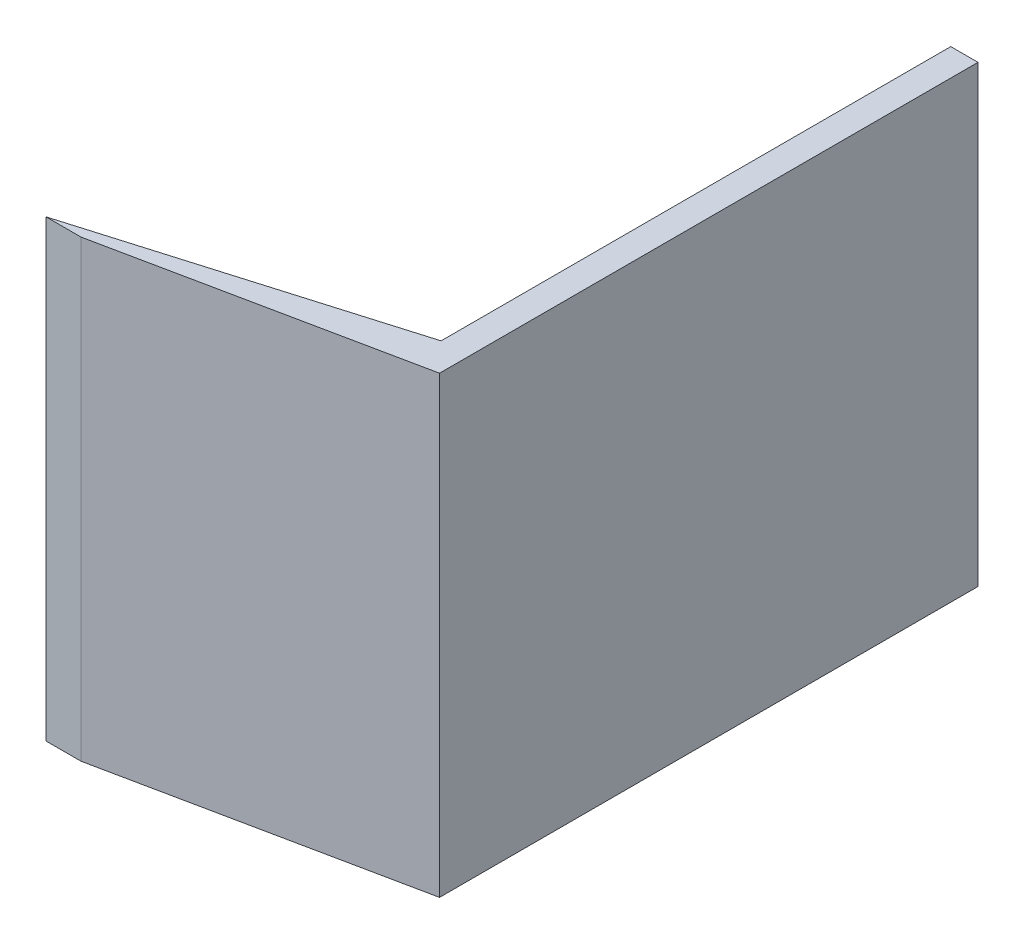
ISO-10303-21;
HEADER;
FILE_DESCRIPTION(('STEP AP214'),'2;1');
FILE_NAME('part.step','',(''),(''),'','','');
FILE_SCHEMA(('AUTOMOTIVE_DESIGN { 1 0 10303 214 1 1 1 1 }'));
ENDSEC;
DATA;
#1=APPLICATION_CONTEXT('core data for automotive mechanical design processes');
#2=APPLICATION_PROTOCOL_DEFINITION('international standard','automotive_design',2000,#1);
#3=PRODUCT_CONTEXT('',#1,'mechanical');
#4=PRODUCT('Part','Part','',(#3));
#5=PRODUCT_RELATED_PRODUCT_CATEGORY('part','',(#4));
#6=PRODUCT_DEFINITION_FORMATION('','',#4);
#7=PRODUCT_DEFINITION_CONTEXT('part definition',#1,'design');
#8=PRODUCT_DEFINITION('design','',#6,#7);
#9=PRODUCT_DEFINITION_SHAPE('','',#8);
#10=(LENGTH_UNIT() NAMED_UNIT(*) SI_UNIT(.MILLI.,.METRE.));
#11=(NAMED_UNIT(*) PLANE_ANGLE_UNIT() SI_UNIT($,.RADIAN.));
#12=(NAMED_UNIT(*) SI_UNIT($,.STERADIAN.) SOLID_ANGLE_UNIT());
#13=UNCERTAINTY_MEASURE_WITH_UNIT(LENGTH_MEASURE(1.E-05),#10,'distance_accuracy_value','');
#14=(GEOMETRIC_REPRESENTATION_CONTEXT(3) GLOBAL_UNCERTAINTY_ASSIGNED_CONTEXT((#13)) GLOBAL_UNIT_ASSIGNED_CONTEXT((#10,
#11,#12)) REPRESENTATION_CONTEXT('',''));
#15=CARTESIAN_POINT('',(0.,0.,0.));
#16=DIRECTION('',(0.,0.,1.));
#17=DIRECTION('',(1.,0.,0.));
#18=AXIS2_PLACEMENT_3D('',#15,#16,#17);
#19=CARTESIAN_POINT('',(0.,50.,0.));
#20=DIRECTION('',(1.,0.,0.));
#21=DIRECTION('',(0.,0.,-1.));
#22=AXIS2_PLACEMENT_3D('',#19,#20,#21);
#23=PLANE('',#22);
#24=DIRECTION('',(0.,0.,1.));
#25=VECTOR('',#24,1.);
#26=CARTESIAN_POINT('',(0.,0.,0.));
#27=LINE('',#26,#25);
#28=CARTESIAN_POINT('',(0.,0.,-46.72));
#29=VERTEX_POINT('',#28);
#30=CARTESIAN_POINT('',(0.,0.,0.));
#31=VERTEX_POINT('',#30);
#32=EDGE_CURVE('E132',#29,#31,#27,.T.);
#33=ORIENTED_EDGE('',*,*,#32,.T.);
#34=DIRECTION('',(0.,-1.,0.));
#35=VECTOR('',#34,1.);
#36=CARTESIAN_POINT('',(0.,50.,0.));
#37=LINE('',#36,#35);
#38=CARTESIAN_POINT('',(0.,50.,0.));
#39=VERTEX_POINT('',#38);
#40=EDGE_CURVE('E11',#39,#31,#37,.T.);
#41=ORIENTED_EDGE('',*,*,#40,.F.);
#42=DIRECTION('',(0.,0.,1.));
#43=VECTOR('',#42,1.);
#44=CARTESIAN_POINT('',(0.,50.,0.));
#45=LINE('',#44,#43);
#46=CARTESIAN_POINT('',(0.,50.,-46.72));
#47=VERTEX_POINT('',#46);
#48=EDGE_CURVE('E148',#47,#39,#45,.T.);
#49=ORIENTED_EDGE('',*,*,#48,.F.);
#50=DIRECTION('',(0.,-1.,0.));
#51=VECTOR('',#50,1.);
#52=CARTESIAN_POINT('',(0.,50.,-46.72));
#53=LINE('',#52,#51);
#54=EDGE_CURVE('E128',#47,#29,#53,.T.);
#55=ORIENTED_EDGE('',*,*,#54,.T.);
#56=EDGE_LOOP('',(#33,#41,#49,#55));
#57=FACE_BOUND('',#56,.T.);
#58=ADVANCED_FACE('F35',(#57),#23,.F.);
#59=CARTESIAN_POINT('',(0.,50.,0.));
#60=DIRECTION('',(0.999984471830344,0.,-0.00557279985182867));
#61=DIRECTION('',(-0.00557279985182867,0.,-0.999984471830344));
#62=AXIS2_PLACEMENT_3D('',#59,#60,#61);
#63=PLANE('',#62);
#64=DIRECTION('',(0.00557279985182867,0.,0.999984471830344));
#65=VECTOR('',#64,1.);
#66=CARTESIAN_POINT('',(0.,0.,0.));
#67=LINE('',#66,#65);
#68=CARTESIAN_POINT('',(0.000186336589127773,0.,0.0334362798980588));
#69=VERTEX_POINT('',#68);
#70=EDGE_CURVE('E135',#31,#69,#67,.T.);
#71=ORIENTED_EDGE('',*,*,#70,.T.);
#72=DIRECTION('',(0.,-1.,0.));
#73=VECTOR('',#72,1.);
#74=CARTESIAN_POINT('',(0.000186336589127773,50.,0.0334362798980588));
#75=LINE('',#74,#73);
#76=CARTESIAN_POINT('',(0.000186336589127773,50.,0.0334362798980588));
#77=VERTEX_POINT('',#76);
#78=EDGE_CURVE('E43',#77,#69,#75,.T.);
#79=ORIENTED_EDGE('',*,*,#78,.F.);
#80=DIRECTION('',(0.00557279985182867,0.,0.999984471830344));
#81=VECTOR('',#80,1.);
#82=CARTESIAN_POINT('',(0.,50.,0.));
#83=LINE('',#82,#81);
#84=EDGE_CURVE('E94',#39,#77,#83,.T.);
#85=ORIENTED_EDGE('',*,*,#84,.F.);
#86=ORIENTED_EDGE('',*,*,#40,.T.);
#87=EDGE_LOOP('',(#71,#79,#85,#86));
#88=FACE_BOUND('',#87,.T.);
#89=ADVANCED_FACE('F178',(#88),#63,.F.);
#90=CARTESIAN_POINT('',(0.000186336589127775,50.,0.));
#91=DIRECTION('',(1.,0.,0.));
#92=DIRECTION('',(0.,0.,-1.));
#93=AXIS2_PLACEMENT_3D('',#90,#91,#92);
#94=PLANE('',#93);
#95=DIRECTION('',(0.,0.,1.));
#96=VECTOR('',#95,1.);
#97=CARTESIAN_POINT('',(0.000186336589127775,0.,0.));
#98=LINE('',#97,#96);
#99=CARTESIAN_POINT('',(0.000186336589127339,0.,9.41378964474691));
#100=VERTEX_POINT('',#99);
#101=EDGE_CURVE('E137',#69,#100,#98,.T.);
#102=ORIENTED_EDGE('',*,*,#101,.T.);
#103=DIRECTION('',(0.,-1.,0.));
#104=VECTOR('',#103,1.);
#105=CARTESIAN_POINT('',(0.000186336589127339,50.,9.41378964474691));
#106=LINE('',#105,#104);
#107=CARTESIAN_POINT('',(0.000186336589127339,50.,9.41378964474691));
#108=VERTEX_POINT('',#107);
#109=EDGE_CURVE('E154',#108,#100,#106,.T.);
#110=ORIENTED_EDGE('',*,*,#109,.F.);
#111=DIRECTION('',(0.,0.,1.));
#112=VECTOR('',#111,1.);
#113=CARTESIAN_POINT('',(0.000186336589127775,50.,0.));
#114=LINE('',#113,#112);
#115=EDGE_CURVE('E161',#77,#108,#114,.T.);
#116=ORIENTED_EDGE('',*,*,#115,.F.);
#117=ORIENTED_EDGE('',*,*,#78,.T.);
#118=EDGE_LOOP('',(#102,#110,#116,#117));
#119=FACE_BOUND('',#118,.T.);
#120=ADVANCED_FACE('F159',(#119),#94,.F.);
#121=CARTESIAN_POINT('',(2.55892323496985,50.,8.65749573456958));
#122=DIRECTION('',(-0.283450742754156,0.,-0.958986796797598));
#123=DIRECTION('',(-0.958986796797598,0.,0.283450742754156));
#124=AXIS2_PLACEMENT_3D('',#121,#122,#123);
#125=PLANE('',#124);
#126=DIRECTION('',(0.958986796797598,0.,-0.283450742754156));
#127=VECTOR('',#126,1.);
#128=CARTESIAN_POINT('',(2.55892323496985,0.,8.65749573456958));
#129=LINE('',#128,#127);
#130=CARTESIAN_POINT('',(-33.5867909433907,0.,19.3411981228081));
#131=VERTEX_POINT('',#130);
#132=EDGE_CURVE('E140',#131,#100,#129,.T.);
#133=ORIENTED_EDGE('',*,*,#132,.F.);
#134=DIRECTION('',(0.,-1.,0.));
#135=VECTOR('',#134,1.);
#136=CARTESIAN_POINT('',(-33.5867909433907,50.,19.3411981228081));
#137=LINE('',#136,#135);
#138=CARTESIAN_POINT('',(-33.5867909433907,50.,19.3411981228081));
#139=VERTEX_POINT('',#138);
#140=EDGE_CURVE('E152',#139,#131,#137,.T.);
#141=ORIENTED_EDGE('',*,*,#140,.F.);
#142=DIRECTION('',(0.958986796797598,0.,-0.283450742754156));
#143=VECTOR('',#142,1.);
#144=CARTESIAN_POINT('',(2.55892323496985,50.,8.65749573456958));
#145=LINE('',#144,#143);
#146=EDGE_CURVE('E170',#139,#108,#145,.T.);
#147=ORIENTED_EDGE('',*,*,#146,.T.);
#148=ORIENTED_EDGE('',*,*,#109,.T.);
#149=EDGE_LOOP('',(#133,#141,#147,#148));
#150=FACE_BOUND('',#149,.T.);
#151=ADVANCED_FACE('F168',(#150),#125,.T.);
#152=CARTESIAN_POINT('',(0.,50.,19.3411981228081));
#153=DIRECTION('',(0.,0.,-1.));
#154=DIRECTION('',(-1.,0.,0.));
#155=AXIS2_PLACEMENT_3D('',#152,#153,#154);
#156=PLANE('',#155);
#157=DIRECTION('',(1.,0.,0.));
#158=VECTOR('',#157,1.);
#159=CARTESIAN_POINT('',(0.,0.,19.3411981228081));
#160=LINE('',#159,#158);
#161=CARTESIAN_POINT('',(-29.7247872958744,0.,19.3411981228081));
#162=VERTEX_POINT('',#161);
#163=EDGE_CURVE('E143',#131,#162,#160,.T.);
#164=ORIENTED_EDGE('',*,*,#163,.T.);
#165=DIRECTION('',(0.,-1.,0.));
#166=VECTOR('',#165,1.);
#167=CARTESIAN_POINT('',(-29.7247872958744,50.,19.3411981228081));
#168=LINE('',#167,#166);
#169=CARTESIAN_POINT('',(-29.7247872958744,50.,19.3411981228081));
#170=VERTEX_POINT('',#169);
#171=EDGE_CURVE('E123',#170,#162,#168,.T.);
#172=ORIENTED_EDGE('',*,*,#171,.F.);
#173=DIRECTION('',(1.,0.,0.));
#174=VECTOR('',#173,1.);
#175=CARTESIAN_POINT('',(0.,50.,19.3411981228081));
#176=LINE('',#175,#174);
#177=EDGE_CURVE('E114',#139,#170,#176,.T.);
#178=ORIENTED_EDGE('',*,*,#177,.F.);
#179=ORIENTED_EDGE('',*,*,#140,.T.);
#180=EDGE_LOOP('',(#164,#172,#178,#179));
#181=FACE_BOUND('',#180,.T.);
#182=ADVANCED_FACE('F188',(#181),#156,.F.);
#183=CARTESIAN_POINT('',(2.61464172215007,50.,12.6646708416712));
#184=DIRECTION('',(-0.202187723277373,0.,-0.979346784625299));
#185=DIRECTION('',(-0.9793467846253,0.,0.202187723277373));
#186=AXIS2_PLACEMENT_3D('',#183,#184,#185);
#187=PLANE('',#186);
#188=DIRECTION('',(0.979346784625299,0.,-0.202187723277373));
#189=VECTOR('',#188,1.);
#190=CARTESIAN_POINT('',(2.61464172215007,0.,12.6646708416712));
#191=LINE('',#190,#189);
#192=CARTESIAN_POINT('',(3.,0.,12.5851130036635));
#193=VERTEX_POINT('',#192);
#194=EDGE_CURVE('E122',#162,#193,#191,.T.);
#195=ORIENTED_EDGE('',*,*,#194,.T.);
#196=DIRECTION('',(0.,-1.,0.));
#197=VECTOR('',#196,1.);
#198=CARTESIAN_POINT('',(3.,50.,12.5851130036635));
#199=LINE('',#198,#197);
#200=CARTESIAN_POINT('',(3.,50.,12.5851130036635));
#201=VERTEX_POINT('',#200);
#202=EDGE_CURVE('E119',#201,#193,#199,.T.);
#203=ORIENTED_EDGE('',*,*,#202,.F.);
#204=DIRECTION('',(0.979346784625299,0.,-0.202187723277373));
#205=VECTOR('',#204,1.);
#206=CARTESIAN_POINT('',(2.61464172215007,50.,12.6646708416712));
#207=LINE('',#206,#205);
#208=EDGE_CURVE('E107',#170,#201,#207,.T.);
#209=ORIENTED_EDGE('',*,*,#208,.F.);
#210=ORIENTED_EDGE('',*,*,#171,.T.);
#211=EDGE_LOOP('',(#195,#203,#209,#210));
#212=FACE_BOUND('',#211,.T.);
#213=ADVANCED_FACE('F120',(#212),#187,.F.);
#214=CARTESIAN_POINT('',(3.,50.,0.));
#215=DIRECTION('',(-1.,0.,0.));
#216=DIRECTION('',(0.,0.,1.));
#217=AXIS2_PLACEMENT_3D('',#214,#215,#216);
#218=PLANE('',#217);
#219=DIRECTION('',(0.,0.,-1.));
#220=VECTOR('',#219,1.);
#221=CARTESIAN_POINT('',(3.,0.,0.));
#222=LINE('',#221,#220);
#223=CARTESIAN_POINT('',(3.,0.,-46.72));
#224=VERTEX_POINT('',#223);
#225=EDGE_CURVE('E80',#193,#224,#222,.T.);
#226=ORIENTED_EDGE('',*,*,#225,.T.);
#227=DIRECTION('',(0.,-1.,0.));
#228=VECTOR('',#227,1.);
#229=CARTESIAN_POINT('',(3.,50.,-46.72));
#230=LINE('',#229,#228);
#231=CARTESIAN_POINT('',(3.,50.,-46.72));
#232=VERTEX_POINT('',#231);
#233=EDGE_CURVE('E124',#232,#224,#230,.T.);
#234=ORIENTED_EDGE('',*,*,#233,.F.);
#235=DIRECTION('',(0.,0.,-1.));
#236=VECTOR('',#235,1.);
#237=CARTESIAN_POINT('',(3.,50.,0.));
#238=LINE('',#237,#236);
#239=EDGE_CURVE('E111',#201,#232,#238,.T.);
#240=ORIENTED_EDGE('',*,*,#239,.F.);
#241=ORIENTED_EDGE('',*,*,#202,.T.);
#242=EDGE_LOOP('',(#226,#234,#240,#241));
#243=FACE_BOUND('',#242,.T.);
#244=ADVANCED_FACE('F126',(#243),#218,.F.);
#245=CARTESIAN_POINT('',(0.,50.,-46.72));
#246=DIRECTION('',(0.,0.,1.));
#247=DIRECTION('',(1.,0.,0.));
#248=AXIS2_PLACEMENT_3D('',#245,#246,#247);
#249=PLANE('',#248);
#250=DIRECTION('',(-1.,0.,0.));
#251=VECTOR('',#250,1.);
#252=CARTESIAN_POINT('',(0.,0.,-46.72));
#253=LINE('',#252,#251);
#254=EDGE_CURVE('E86',#224,#29,#253,.T.);
#255=ORIENTED_EDGE('',*,*,#254,.T.);
#256=ORIENTED_EDGE('',*,*,#54,.F.);
#257=DIRECTION('',(-1.,0.,0.));
#258=VECTOR('',#257,1.);
#259=CARTESIAN_POINT('',(0.,50.,-46.72));
#260=LINE('',#259,#258);
#261=EDGE_CURVE('E51',#232,#47,#260,.T.);
#262=ORIENTED_EDGE('',*,*,#261,.F.);
#263=ORIENTED_EDGE('',*,*,#233,.T.);
#264=EDGE_LOOP('',(#255,#256,#262,#263));
#265=FACE_BOUND('',#264,.T.);
#266=ADVANCED_FACE('F196',(#265),#249,.F.);
#267=CARTESIAN_POINT('',(0.,50.,0.));
#268=DIRECTION('',(0.,1.,0.));
#269=DIRECTION('',(0.,0.,1.));
#270=AXIS2_PLACEMENT_3D('',#267,#268,#269);
#271=PLANE('',#270);
#272=ORIENTED_EDGE('',*,*,#48,.T.);
#273=ORIENTED_EDGE('',*,*,#84,.T.);
#274=ORIENTED_EDGE('',*,*,#115,.T.);
#275=ORIENTED_EDGE('',*,*,#146,.F.);
#276=ORIENTED_EDGE('',*,*,#177,.T.);
#277=ORIENTED_EDGE('',*,*,#208,.T.);
#278=ORIENTED_EDGE('',*,*,#239,.T.);
#279=ORIENTED_EDGE('',*,*,#261,.T.);
#280=EDGE_LOOP('',(#272,#273,#274,#275,#276,#277,#278,#279));
#281=FACE_BOUND('',#280,.T.);
#282=ADVANCED_FACE('F109',(#281),#271,.T.);
#283=CARTESIAN_POINT('',(0.,0.,0.));
#284=DIRECTION('',(0.,1.,0.));
#285=DIRECTION('',(0.,0.,1.));
#286=AXIS2_PLACEMENT_3D('',#283,#284,#285);
#287=PLANE('',#286);
#288=ORIENTED_EDGE('',*,*,#32,.F.);
#289=ORIENTED_EDGE('',*,*,#254,.F.);
#290=ORIENTED_EDGE('',*,*,#225,.F.);
#291=ORIENTED_EDGE('',*,*,#194,.F.);
#292=ORIENTED_EDGE('',*,*,#163,.F.);
#293=ORIENTED_EDGE('',*,*,#132,.T.);
#294=ORIENTED_EDGE('',*,*,#101,.F.);
#295=ORIENTED_EDGE('',*,*,#70,.F.);
#296=EDGE_LOOP('',(#288,#289,#290,#291,#292,#293,#294,#295));
#297=FACE_BOUND('',#296,.T.);
#298=ADVANCED_FACE('F164',(#297),#287,.F.);
#299=CLOSED_SHELL('',(#58,#89,#120,#151,#182,#213,#244,#266,#282,#298));
#300=MANIFOLD_SOLID_BREP('B2',#299);
#301=ADVANCED_BREP_SHAPE_REPRESENTATION('',(#18,#300),#14);
#302=SHAPE_DEFINITION_REPRESENTATION(#9,#301);
ENDSEC;
END-ISO-10303-21;
